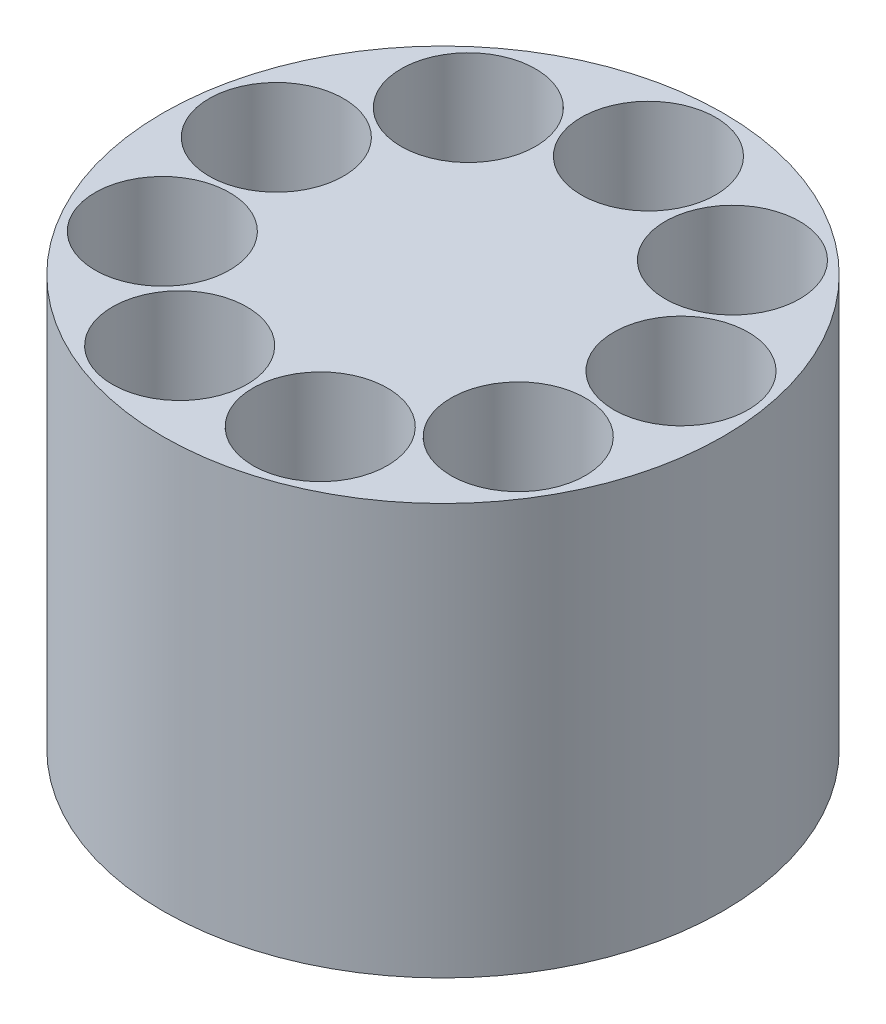
ISO-10303-21;
HEADER;
FILE_DESCRIPTION(('STEP AP214'),'2;1');
FILE_NAME('part.step','',(''),(''),'','','');
FILE_SCHEMA(('AUTOMOTIVE_DESIGN { 1 0 10303 214 1 1 1 1 }'));
ENDSEC;
DATA;
#1=APPLICATION_CONTEXT('core data for automotive mechanical design processes');
#2=APPLICATION_PROTOCOL_DEFINITION('international standard','automotive_design',2000,#1);
#3=PRODUCT_CONTEXT('',#1,'mechanical');
#4=PRODUCT('Part','Part','',(#3));
#5=PRODUCT_RELATED_PRODUCT_CATEGORY('part','',(#4));
#6=PRODUCT_DEFINITION_FORMATION('','',#4);
#7=PRODUCT_DEFINITION_CONTEXT('part definition',#1,'design');
#8=PRODUCT_DEFINITION('design','',#6,#7);
#9=PRODUCT_DEFINITION_SHAPE('','',#8);
#10=(LENGTH_UNIT() NAMED_UNIT(*) SI_UNIT(.MILLI.,.METRE.));
#11=(NAMED_UNIT(*) PLANE_ANGLE_UNIT() SI_UNIT($,.RADIAN.));
#12=(NAMED_UNIT(*) SI_UNIT($,.STERADIAN.) SOLID_ANGLE_UNIT());
#13=UNCERTAINTY_MEASURE_WITH_UNIT(LENGTH_MEASURE(1.E-05),#10,'distance_accuracy_value','');
#14=(GEOMETRIC_REPRESENTATION_CONTEXT(3) GLOBAL_UNCERTAINTY_ASSIGNED_CONTEXT((#13)) GLOBAL_UNIT_ASSIGNED_CONTEXT((#10,
#11,#12)) REPRESENTATION_CONTEXT('',''));
#15=CARTESIAN_POINT('',(0.,0.,0.));
#16=DIRECTION('',(0.,0.,1.));
#17=DIRECTION('',(1.,0.,0.));
#18=AXIS2_PLACEMENT_3D('',#15,#16,#17);
#19=CARTESIAN_POINT('',(0.,220.,0.));
#20=DIRECTION('',(0.,-1.,0.));
#21=DIRECTION('',(0.,0.,-1.));
#22=AXIS2_PLACEMENT_3D('',#19,#20,#21);
#23=CYLINDRICAL_SURFACE('',#22,12.5);
#24=CARTESIAN_POINT('',(0.,0.,0.));
#25=DIRECTION('',(0.,1.,0.));
#26=DIRECTION('',(0.,0.,1.));
#27=AXIS2_PLACEMENT_3D('',#24,#25,#26);
#28=CIRCLE('',#27,12.5);
#29=CARTESIAN_POINT('',(0.,0.,12.5));
#30=VERTEX_POINT('',#29);
#31=EDGE_CURVE('E120',#30,#30,#28,.T.);
#32=ORIENTED_EDGE('',*,*,#31,.F.);
#33=EDGE_LOOP('',(#32));
#34=FACE_BOUND('',#33,.T.);
#35=CARTESIAN_POINT('',(0.,210.,0.));
#36=DIRECTION('',(0.,1.,0.));
#37=DIRECTION('',(0.,0.,1.));
#38=AXIS2_PLACEMENT_3D('',#35,#36,#37);
#39=CIRCLE('',#38,12.5000000000001);
#40=CARTESIAN_POINT('',(0.,210.,12.5000000000001));
#41=VERTEX_POINT('',#40);
#42=EDGE_CURVE('E127',#41,#41,#39,.T.);
#43=ORIENTED_EDGE('',*,*,#42,.T.);
#44=EDGE_LOOP('',(#43));
#45=FACE_BOUND('',#44,.T.);
#46=ADVANCED_FACE('F37',(#34,#45),#23,.F.);
#47=CARTESIAN_POINT('',(0.,220.,0.));
#48=DIRECTION('',(0.,1.,0.));
#49=DIRECTION('',(0.,0.,1.));
#50=AXIS2_PLACEMENT_3D('',#47,#48,#49);
#51=PLANE('',#50);
#52=CARTESIAN_POINT('',(-70.7066370655194,220.,-84.2648887430876));
#53=DIRECTION('',(0.,1.,0.));
#54=DIRECTION('',(0.,0.,1.));
#55=AXIS2_PLACEMENT_3D('',#52,#53,#54);
#56=CIRCLE('',#55,36.0000000000002);
#57=CARTESIAN_POINT('',(-70.7066370655194,220.,-48.2648887430873));
#58=VERTEX_POINT('',#57);
#59=EDGE_CURVE('E112',#58,#58,#56,.T.);
#60=ORIENTED_EDGE('',*,*,#59,.F.);
#61=EDGE_LOOP('',(#60));
#62=FACE_BOUND('',#61,.T.);
#63=CARTESIAN_POINT('',(-95.2627944162882,220.,55.));
#64=DIRECTION('',(0.,1.,0.));
#65=DIRECTION('',(0.,0.,1.));
#66=AXIS2_PLACEMENT_3D('',#63,#64,#65);
#67=CIRCLE('',#66,36.0000000000002);
#68=CARTESIAN_POINT('',(-95.2627944162882,220.,91.0000000000003));
#69=VERTEX_POINT('',#68);
#70=EDGE_CURVE('E96',#69,#69,#67,.T.);
#71=ORIENTED_EDGE('',*,*,#70,.F.);
#72=EDGE_LOOP('',(#71));
#73=FACE_BOUND('',#72,.T.);
#74=CARTESIAN_POINT('',(37.6222157658236,220.,103.36618828645));
#75=DIRECTION('',(0.,1.,0.));
#76=DIRECTION('',(0.,0.,1.));
#77=AXIS2_PLACEMENT_3D('',#74,#75,#76);
#78=CIRCLE('',#77,36.0000000000002);
#79=CARTESIAN_POINT('',(37.6222157658236,220.,139.36618828645));
#80=VERTEX_POINT('',#79);
#81=EDGE_CURVE('E80',#80,#80,#78,.T.);
#82=ORIENTED_EDGE('',*,*,#81,.F.);
#83=EDGE_LOOP('',(#82));
#84=FACE_BOUND('',#83,.T.);
#85=CARTESIAN_POINT('',(108.328852831343,220.,-19.1012995433624));
#86=DIRECTION('',(0.,1.,0.));
#87=DIRECTION('',(0.,0.,1.));
#88=AXIS2_PLACEMENT_3D('',#85,#86,#87);
#89=CIRCLE('',#88,36.0000000000002);
#90=CARTESIAN_POINT('',(108.328852831343,220.,16.8987004566379));
#91=VERTEX_POINT('',#90);
#92=EDGE_CURVE('E64',#91,#91,#89,.T.);
#93=ORIENTED_EDGE('',*,*,#92,.F.);
#94=EDGE_LOOP('',(#93));
#95=FACE_BOUND('',#94,.T.);
#96=CARTESIAN_POINT('',(0.,220.,-110.));
#97=DIRECTION('',(0.,1.,0.));
#98=DIRECTION('',(0.,0.,1.));
#99=AXIS2_PLACEMENT_3D('',#96,#97,#98);
#100=CIRCLE('',#99,36.0000000000002);
#101=CARTESIAN_POINT('',(0.,220.,-73.9999999999998));
#102=VERTEX_POINT('',#101);
#103=EDGE_CURVE('E50',#102,#102,#100,.T.);
#104=ORIENTED_EDGE('',*,*,#103,.F.);
#105=EDGE_LOOP('',(#104));
#106=FACE_BOUND('',#105,.T.);
#107=CARTESIAN_POINT('',(0.,220.,0.));
#108=DIRECTION('',(0.,1.,0.));
#109=DIRECTION('',(0.,0.,1.));
#110=AXIS2_PLACEMENT_3D('',#107,#108,#109);
#111=CIRCLE('',#110,150.);
#112=CARTESIAN_POINT('',(0.,220.,150.));
#113=VERTEX_POINT('',#112);
#114=EDGE_CURVE('E10',#113,#113,#111,.T.);
#115=ORIENTED_EDGE('',*,*,#114,.T.);
#116=EDGE_LOOP('',(#115));
#117=FACE_BOUND('',#116,.T.);
#118=CARTESIAN_POINT('',(70.7066370655193,220.,-84.2648887430876));
#119=DIRECTION('',(0.,1.,0.));
#120=DIRECTION('',(0.,0.,1.));
#121=AXIS2_PLACEMENT_3D('',#118,#119,#120);
#122=CIRCLE('',#121,36.0000000000002);
#123=CARTESIAN_POINT('',(70.7066370655193,220.,-48.2648887430873));
#124=VERTEX_POINT('',#123);
#125=EDGE_CURVE('E56',#124,#124,#122,.T.);
#126=ORIENTED_EDGE('',*,*,#125,.F.);
#127=EDGE_LOOP('',(#126));
#128=FACE_BOUND('',#127,.T.);
#129=CARTESIAN_POINT('',(95.2627944162883,220.,55.));
#130=DIRECTION('',(0.,1.,0.));
#131=DIRECTION('',(0.,0.,1.));
#132=AXIS2_PLACEMENT_3D('',#129,#130,#131);
#133=CIRCLE('',#132,36.0000000000002);
#134=CARTESIAN_POINT('',(95.2627944162883,220.,91.0000000000002));
#135=VERTEX_POINT('',#134);
#136=EDGE_CURVE('E72',#135,#135,#133,.T.);
#137=ORIENTED_EDGE('',*,*,#136,.F.);
#138=EDGE_LOOP('',(#137));
#139=FACE_BOUND('',#138,.T.);
#140=CARTESIAN_POINT('',(-37.6222157658235,220.,103.36618828645));
#141=DIRECTION('',(0.,1.,0.));
#142=DIRECTION('',(0.,0.,1.));
#143=AXIS2_PLACEMENT_3D('',#140,#141,#142);
#144=CIRCLE('',#143,36.0000000000002);
#145=CARTESIAN_POINT('',(-37.6222157658235,220.,139.36618828645));
#146=VERTEX_POINT('',#145);
#147=EDGE_CURVE('E88',#146,#146,#144,.T.);
#148=ORIENTED_EDGE('',*,*,#147,.F.);
#149=EDGE_LOOP('',(#148));
#150=FACE_BOUND('',#149,.T.);
#151=CARTESIAN_POINT('',(-108.328852831343,220.,-19.1012995433623));
#152=DIRECTION('',(0.,1.,0.));
#153=DIRECTION('',(0.,0.,1.));
#154=AXIS2_PLACEMENT_3D('',#151,#152,#153);
#155=CIRCLE('',#154,36.0000000000002);
#156=CARTESIAN_POINT('',(-108.328852831343,220.,16.8987004566379));
#157=VERTEX_POINT('',#156);
#158=EDGE_CURVE('E104',#157,#157,#155,.T.);
#159=ORIENTED_EDGE('',*,*,#158,.F.);
#160=EDGE_LOOP('',(#159));
#161=FACE_BOUND('',#160,.T.);
#162=ADVANCED_FACE('F146',(#62,#73,#84,#95,#106,#117,#128,#139,#150,#161),#51,.T.);
#163=CARTESIAN_POINT('',(0.,0.,0.));
#164=DIRECTION('',(0.,1.,0.));
#165=DIRECTION('',(0.,0.,1.));
#166=AXIS2_PLACEMENT_3D('',#163,#164,#165);
#167=PLANE('',#166);
#168=CARTESIAN_POINT('',(0.,0.,0.));
#169=DIRECTION('',(0.,1.,0.));
#170=DIRECTION('',(0.,0.,1.));
#171=AXIS2_PLACEMENT_3D('',#168,#169,#170);
#172=CIRCLE('',#171,150.);
#173=CARTESIAN_POINT('',(0.,0.,150.));
#174=VERTEX_POINT('',#173);
#175=EDGE_CURVE('E41',#174,#174,#172,.T.);
#176=ORIENTED_EDGE('',*,*,#175,.F.);
#177=EDGE_LOOP('',(#176));
#178=FACE_BOUND('',#177,.T.);
#179=CARTESIAN_POINT('',(0.,0.,-110.));
#180=DIRECTION('',(0.,1.,0.));
#181=DIRECTION('',(0.,0.,1.));
#182=AXIS2_PLACEMENT_3D('',#179,#180,#181);
#183=CIRCLE('',#182,36.0000000000002);
#184=CARTESIAN_POINT('',(0.,0.,-73.9999999999998));
#185=VERTEX_POINT('',#184);
#186=EDGE_CURVE('E52',#185,#185,#183,.T.);
#187=ORIENTED_EDGE('',*,*,#186,.T.);
#188=EDGE_LOOP('',(#187));
#189=FACE_BOUND('',#188,.T.);
#190=CARTESIAN_POINT('',(70.7066370655193,0.,-84.2648887430876));
#191=DIRECTION('',(0.,1.,0.));
#192=DIRECTION('',(0.,0.,1.));
#193=AXIS2_PLACEMENT_3D('',#190,#191,#192);
#194=CIRCLE('',#193,36.0000000000002);
#195=CARTESIAN_POINT('',(70.7066370655193,0.,-48.2648887430873));
#196=VERTEX_POINT('',#195);
#197=EDGE_CURVE('E60',#196,#196,#194,.T.);
#198=ORIENTED_EDGE('',*,*,#197,.T.);
#199=EDGE_LOOP('',(#198));
#200=FACE_BOUND('',#199,.T.);
#201=CARTESIAN_POINT('',(108.328852831343,0.,-19.1012995433624));
#202=DIRECTION('',(0.,1.,0.));
#203=DIRECTION('',(0.,0.,1.));
#204=AXIS2_PLACEMENT_3D('',#201,#202,#203);
#205=CIRCLE('',#204,36.0000000000002);
#206=CARTESIAN_POINT('',(108.328852831343,0.,16.8987004566379));
#207=VERTEX_POINT('',#206);
#208=EDGE_CURVE('E68',#207,#207,#205,.T.);
#209=ORIENTED_EDGE('',*,*,#208,.T.);
#210=EDGE_LOOP('',(#209));
#211=FACE_BOUND('',#210,.T.);
#212=CARTESIAN_POINT('',(95.2627944162883,0.,55.));
#213=DIRECTION('',(0.,1.,0.));
#214=DIRECTION('',(0.,0.,1.));
#215=AXIS2_PLACEMENT_3D('',#212,#213,#214);
#216=CIRCLE('',#215,36.0000000000002);
#217=CARTESIAN_POINT('',(95.2627944162883,0.,91.0000000000002));
#218=VERTEX_POINT('',#217);
#219=EDGE_CURVE('E76',#218,#218,#216,.T.);
#220=ORIENTED_EDGE('',*,*,#219,.T.);
#221=EDGE_LOOP('',(#220));
#222=FACE_BOUND('',#221,.T.);
#223=CARTESIAN_POINT('',(37.6222157658236,0.,103.36618828645));
#224=DIRECTION('',(0.,1.,0.));
#225=DIRECTION('',(0.,0.,1.));
#226=AXIS2_PLACEMENT_3D('',#223,#224,#225);
#227=CIRCLE('',#226,36.0000000000002);
#228=CARTESIAN_POINT('',(37.6222157658236,0.,139.36618828645));
#229=VERTEX_POINT('',#228);
#230=EDGE_CURVE('E84',#229,#229,#227,.T.);
#231=ORIENTED_EDGE('',*,*,#230,.T.);
#232=EDGE_LOOP('',(#231));
#233=FACE_BOUND('',#232,.T.);
#234=CARTESIAN_POINT('',(-37.6222157658235,0.,103.36618828645));
#235=DIRECTION('',(0.,1.,0.));
#236=DIRECTION('',(0.,0.,1.));
#237=AXIS2_PLACEMENT_3D('',#234,#235,#236);
#238=CIRCLE('',#237,36.0000000000002);
#239=CARTESIAN_POINT('',(-37.6222157658235,0.,139.36618828645));
#240=VERTEX_POINT('',#239);
#241=EDGE_CURVE('E92',#240,#240,#238,.T.);
#242=ORIENTED_EDGE('',*,*,#241,.T.);
#243=EDGE_LOOP('',(#242));
#244=FACE_BOUND('',#243,.T.);
#245=CARTESIAN_POINT('',(-95.2627944162882,0.,55.));
#246=DIRECTION('',(0.,1.,0.));
#247=DIRECTION('',(0.,0.,1.));
#248=AXIS2_PLACEMENT_3D('',#245,#246,#247);
#249=CIRCLE('',#248,36.0000000000002);
#250=CARTESIAN_POINT('',(-95.2627944162882,0.,91.0000000000003));
#251=VERTEX_POINT('',#250);
#252=EDGE_CURVE('E100',#251,#251,#249,.T.);
#253=ORIENTED_EDGE('',*,*,#252,.T.);
#254=EDGE_LOOP('',(#253));
#255=FACE_BOUND('',#254,.T.);
#256=CARTESIAN_POINT('',(-108.328852831343,0.,-19.1012995433623));
#257=DIRECTION('',(0.,1.,0.));
#258=DIRECTION('',(0.,0.,1.));
#259=AXIS2_PLACEMENT_3D('',#256,#257,#258);
#260=CIRCLE('',#259,36.0000000000002);
#261=CARTESIAN_POINT('',(-108.328852831343,0.,16.8987004566379));
#262=VERTEX_POINT('',#261);
#263=EDGE_CURVE('E108',#262,#262,#260,.T.);
#264=ORIENTED_EDGE('',*,*,#263,.T.);
#265=EDGE_LOOP('',(#264));
#266=FACE_BOUND('',#265,.T.);
#267=CARTESIAN_POINT('',(-70.7066370655194,0.,-84.2648887430876));
#268=DIRECTION('',(0.,1.,0.));
#269=DIRECTION('',(0.,0.,1.));
#270=AXIS2_PLACEMENT_3D('',#267,#268,#269);
#271=CIRCLE('',#270,36.0000000000002);
#272=CARTESIAN_POINT('',(-70.7066370655194,0.,-48.2648887430873));
#273=VERTEX_POINT('',#272);
#274=EDGE_CURVE('E116',#273,#273,#271,.T.);
#275=ORIENTED_EDGE('',*,*,#274,.T.);
#276=EDGE_LOOP('',(#275));
#277=FACE_BOUND('',#276,.T.);
#278=ORIENTED_EDGE('',*,*,#31,.T.);
#279=EDGE_LOOP('',(#278));
#280=FACE_BOUND('',#279,.T.);
#281=ADVANCED_FACE('F152',(#178,#189,#200,#211,#222,#233,#244,#255,#266,#277,#280),#167,.F.);
#282=CARTESIAN_POINT('',(0.,220.,0.));
#283=DIRECTION('',(0.,-1.,0.));
#284=DIRECTION('',(0.,0.,-1.));
#285=AXIS2_PLACEMENT_3D('',#282,#283,#284);
#286=CYLINDRICAL_SURFACE('',#285,150.);
#287=ORIENTED_EDGE('',*,*,#114,.F.);
#288=EDGE_LOOP('',(#287));
#289=FACE_BOUND('',#288,.T.);
#290=ORIENTED_EDGE('',*,*,#175,.T.);
#291=EDGE_LOOP('',(#290));
#292=FACE_BOUND('',#291,.T.);
#293=ADVANCED_FACE('F39',(#289,#292),#286,.T.);
#294=CARTESIAN_POINT('',(0.,220.,-110.));
#295=DIRECTION('',(0.,-1.,0.));
#296=DIRECTION('',(0.,0.,-1.));
#297=AXIS2_PLACEMENT_3D('',#294,#295,#296);
#298=CYLINDRICAL_SURFACE('',#297,36.0000000000002);
#299=ORIENTED_EDGE('',*,*,#103,.T.);
#300=EDGE_LOOP('',(#299));
#301=FACE_BOUND('',#300,.T.);
#302=ORIENTED_EDGE('',*,*,#186,.F.);
#303=EDGE_LOOP('',(#302));
#304=FACE_BOUND('',#303,.T.);
#305=ADVANCED_FACE('F183',(#301,#304),#298,.F.);
#306=CARTESIAN_POINT('',(70.7066370655193,220.,-84.2648887430876));
#307=DIRECTION('',(0.,-1.,0.));
#308=DIRECTION('',(0.,0.,-1.));
#309=AXIS2_PLACEMENT_3D('',#306,#307,#308);
#310=CYLINDRICAL_SURFACE('',#309,36.0000000000002);
#311=ORIENTED_EDGE('',*,*,#125,.T.);
#312=EDGE_LOOP('',(#311));
#313=FACE_BOUND('',#312,.T.);
#314=ORIENTED_EDGE('',*,*,#197,.F.);
#315=EDGE_LOOP('',(#314));
#316=FACE_BOUND('',#315,.T.);
#317=ADVANCED_FACE('F179',(#313,#316),#310,.F.);
#318=CARTESIAN_POINT('',(108.328852831343,220.,-19.1012995433624));
#319=DIRECTION('',(0.,-1.,0.));
#320=DIRECTION('',(0.,0.,-1.));
#321=AXIS2_PLACEMENT_3D('',#318,#319,#320);
#322=CYLINDRICAL_SURFACE('',#321,36.0000000000002);
#323=ORIENTED_EDGE('',*,*,#92,.T.);
#324=EDGE_LOOP('',(#323));
#325=FACE_BOUND('',#324,.T.);
#326=ORIENTED_EDGE('',*,*,#208,.F.);
#327=EDGE_LOOP('',(#326));
#328=FACE_BOUND('',#327,.T.);
#329=ADVANCED_FACE('F175',(#325,#328),#322,.F.);
#330=CARTESIAN_POINT('',(95.2627944162883,220.,55.));
#331=DIRECTION('',(0.,-1.,0.));
#332=DIRECTION('',(0.,0.,-1.));
#333=AXIS2_PLACEMENT_3D('',#330,#331,#332);
#334=CYLINDRICAL_SURFACE('',#333,36.0000000000002);
#335=ORIENTED_EDGE('',*,*,#136,.T.);
#336=EDGE_LOOP('',(#335));
#337=FACE_BOUND('',#336,.T.);
#338=ORIENTED_EDGE('',*,*,#219,.F.);
#339=EDGE_LOOP('',(#338));
#340=FACE_BOUND('',#339,.T.);
#341=ADVANCED_FACE('F171',(#337,#340),#334,.F.);
#342=CARTESIAN_POINT('',(37.6222157658236,220.,103.36618828645));
#343=DIRECTION('',(0.,-1.,0.));
#344=DIRECTION('',(0.,0.,-1.));
#345=AXIS2_PLACEMENT_3D('',#342,#343,#344);
#346=CYLINDRICAL_SURFACE('',#345,36.0000000000002);
#347=ORIENTED_EDGE('',*,*,#81,.T.);
#348=EDGE_LOOP('',(#347));
#349=FACE_BOUND('',#348,.T.);
#350=ORIENTED_EDGE('',*,*,#230,.F.);
#351=EDGE_LOOP('',(#350));
#352=FACE_BOUND('',#351,.T.);
#353=ADVANCED_FACE('F167',(#349,#352),#346,.F.);
#354=CARTESIAN_POINT('',(-37.6222157658235,220.,103.36618828645));
#355=DIRECTION('',(0.,-1.,0.));
#356=DIRECTION('',(0.,0.,-1.));
#357=AXIS2_PLACEMENT_3D('',#354,#355,#356);
#358=CYLINDRICAL_SURFACE('',#357,36.0000000000002);
#359=ORIENTED_EDGE('',*,*,#147,.T.);
#360=EDGE_LOOP('',(#359));
#361=FACE_BOUND('',#360,.T.);
#362=ORIENTED_EDGE('',*,*,#241,.F.);
#363=EDGE_LOOP('',(#362));
#364=FACE_BOUND('',#363,.T.);
#365=ADVANCED_FACE('F163',(#361,#364),#358,.F.);
#366=CARTESIAN_POINT('',(-95.2627944162882,220.,55.));
#367=DIRECTION('',(0.,-1.,0.));
#368=DIRECTION('',(0.,0.,-1.));
#369=AXIS2_PLACEMENT_3D('',#366,#367,#368);
#370=CYLINDRICAL_SURFACE('',#369,36.0000000000002);
#371=ORIENTED_EDGE('',*,*,#70,.T.);
#372=EDGE_LOOP('',(#371));
#373=FACE_BOUND('',#372,.T.);
#374=ORIENTED_EDGE('',*,*,#252,.F.);
#375=EDGE_LOOP('',(#374));
#376=FACE_BOUND('',#375,.T.);
#377=ADVANCED_FACE('F159',(#373,#376),#370,.F.);
#378=CARTESIAN_POINT('',(-108.328852831343,220.,-19.1012995433623));
#379=DIRECTION('',(0.,-1.,0.));
#380=DIRECTION('',(0.,0.,-1.));
#381=AXIS2_PLACEMENT_3D('',#378,#379,#380);
#382=CYLINDRICAL_SURFACE('',#381,36.0000000000002);
#383=ORIENTED_EDGE('',*,*,#158,.T.);
#384=EDGE_LOOP('',(#383));
#385=FACE_BOUND('',#384,.T.);
#386=ORIENTED_EDGE('',*,*,#263,.F.);
#387=EDGE_LOOP('',(#386));
#388=FACE_BOUND('',#387,.T.);
#389=ADVANCED_FACE('F141',(#385,#388),#382,.F.);
#390=CARTESIAN_POINT('',(-70.7066370655194,220.,-84.2648887430876));
#391=DIRECTION('',(0.,-1.,0.));
#392=DIRECTION('',(0.,0.,-1.));
#393=AXIS2_PLACEMENT_3D('',#390,#391,#392);
#394=CYLINDRICAL_SURFACE('',#393,36.0000000000002);
#395=ORIENTED_EDGE('',*,*,#59,.T.);
#396=EDGE_LOOP('',(#395));
#397=FACE_BOUND('',#396,.T.);
#398=ORIENTED_EDGE('',*,*,#274,.F.);
#399=EDGE_LOOP('',(#398));
#400=FACE_BOUND('',#399,.T.);
#401=ADVANCED_FACE('F135',(#397,#400),#394,.F.);
#402=CARTESIAN_POINT('',(0.,210.,0.));
#403=DIRECTION('',(0.,1.,0.));
#404=DIRECTION('',(0.,0.,1.));
#405=AXIS2_PLACEMENT_3D('',#402,#403,#404);
#406=PLANE('',#405);
#407=ORIENTED_EDGE('',*,*,#42,.F.);
#408=EDGE_LOOP('',(#407));
#409=FACE_BOUND('',#408,.T.);
#410=ADVANCED_FACE('F133',(#409),#406,.F.);
#411=CLOSED_SHELL('',(#46,#162,#281,#293,#305,#317,#329,#341,#353,#365,#377,#389,#401,#410));
#412=MANIFOLD_SOLID_BREP('B2',#411);
#413=ADVANCED_BREP_SHAPE_REPRESENTATION('',(#18,#412),#14);
#414=SHAPE_DEFINITION_REPRESENTATION(#9,#413);
ENDSEC;
END-ISO-10303-21;
